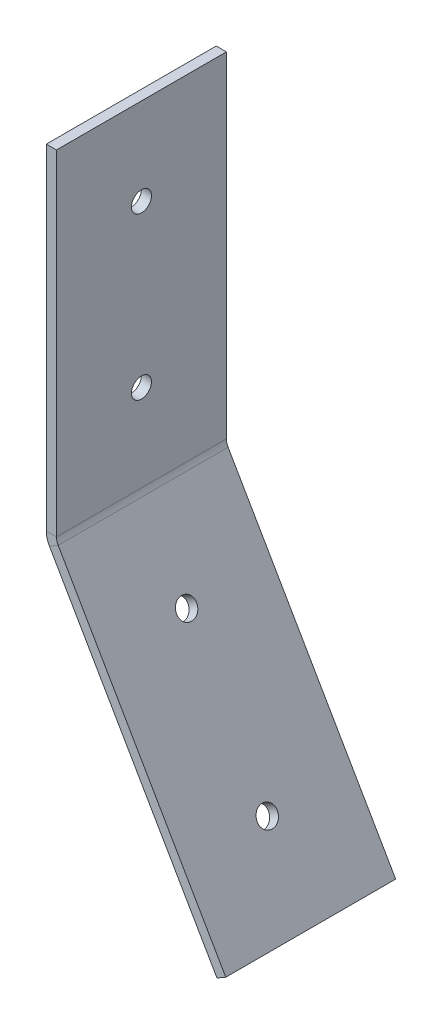
ISO-10303-21;
HEADER;
FILE_DESCRIPTION(('STEP AP214'),'2;1');
FILE_NAME('part.step','',(''),(''),'','','');
FILE_SCHEMA(('AUTOMOTIVE_DESIGN { 1 0 10303 214 1 1 1 1 }'));
ENDSEC;
DATA;
#1=APPLICATION_CONTEXT('core data for automotive mechanical design processes');
#2=APPLICATION_PROTOCOL_DEFINITION('international standard','automotive_design',2000,#1);
#3=PRODUCT_CONTEXT('',#1,'mechanical');
#4=PRODUCT('Part','Part','',(#3));
#5=PRODUCT_RELATED_PRODUCT_CATEGORY('part','',(#4));
#6=PRODUCT_DEFINITION_FORMATION('','',#4);
#7=PRODUCT_DEFINITION_CONTEXT('part definition',#1,'design');
#8=PRODUCT_DEFINITION('design','',#6,#7);
#9=PRODUCT_DEFINITION_SHAPE('','',#8);
#10=(LENGTH_UNIT() NAMED_UNIT(*) SI_UNIT(.MILLI.,.METRE.));
#11=(NAMED_UNIT(*) PLANE_ANGLE_UNIT() SI_UNIT($,.RADIAN.));
#12=(NAMED_UNIT(*) SI_UNIT($,.STERADIAN.) SOLID_ANGLE_UNIT());
#13=UNCERTAINTY_MEASURE_WITH_UNIT(LENGTH_MEASURE(1.E-05),#10,'distance_accuracy_value','');
#14=(GEOMETRIC_REPRESENTATION_CONTEXT(3) GLOBAL_UNCERTAINTY_ASSIGNED_CONTEXT((#13)) GLOBAL_UNIT_ASSIGNED_CONTEXT((#10,
#11,#12)) REPRESENTATION_CONTEXT('',''));
#15=CARTESIAN_POINT('',(0.,0.,0.));
#16=DIRECTION('',(0.,0.,1.));
#17=DIRECTION('',(1.,0.,0.));
#18=AXIS2_PLACEMENT_3D('',#15,#16,#17);
#19=CARTESIAN_POINT('',(-1.51892,0.,0.));
#20=DIRECTION('',(-1.,0.,0.));
#21=DIRECTION('',(0.,0.,1.));
#22=AXIS2_PLACEMENT_3D('',#19,#20,#21);
#23=PLANE('',#22);
#24=CARTESIAN_POINT('',(-1.51892,13.6975539968153,0.));
#25=DIRECTION('',(1.,0.,0.));
#26=DIRECTION('',(0.,0.,-1.));
#27=AXIS2_PLACEMENT_3D('',#24,#25,#26);
#28=CIRCLE('',#27,1.5);
#29=CARTESIAN_POINT('',(-1.51892,13.6975539968153,-1.5));
#30=VERTEX_POINT('',#29);
#31=EDGE_CURVE('E298',#30,#30,#28,.T.);
#32=ORIENTED_EDGE('',*,*,#31,.T.);
#33=EDGE_LOOP('',(#32));
#34=FACE_BOUND('',#33,.T.);
#35=DIRECTION('',(0.,0.,-1.));
#36=VECTOR('',#35,1.);
#37=CARTESIAN_POINT('',(-1.51892,0.69755399681533,0.));
#38=LINE('',#37,#36);
#39=CARTESIAN_POINT('',(-1.51892,0.69755399681533,12.7));
#40=VERTEX_POINT('',#39);
#41=CARTESIAN_POINT('',(-1.51892,0.697553996815328,-12.7));
#42=VERTEX_POINT('',#41);
#43=EDGE_CURVE('E227',#40,#42,#38,.T.);
#44=ORIENTED_EDGE('',*,*,#43,.F.);
#45=DIRECTION('',(0.,-1.,0.));
#46=VECTOR('',#45,1.);
#47=CARTESIAN_POINT('',(-1.51892,-50.8,12.7));
#48=LINE('',#47,#46);
#49=CARTESIAN_POINT('',(-1.51892,50.8,12.7));
#50=VERTEX_POINT('',#49);
#51=EDGE_CURVE('E210',#50,#40,#48,.T.);
#52=ORIENTED_EDGE('',*,*,#51,.F.);
#53=DIRECTION('',(0.,0.,1.));
#54=VECTOR('',#53,1.);
#55=CARTESIAN_POINT('',(-1.51892,50.8,-12.7));
#56=LINE('',#55,#54);
#57=CARTESIAN_POINT('',(-1.51892,50.8,-12.7));
#58=VERTEX_POINT('',#57);
#59=EDGE_CURVE('E213',#58,#50,#56,.T.);
#60=ORIENTED_EDGE('',*,*,#59,.F.);
#61=DIRECTION('',(0.,1.,0.));
#62=VECTOR('',#61,1.);
#63=CARTESIAN_POINT('',(-1.51892,-50.8,-12.7));
#64=LINE('',#63,#62);
#65=EDGE_CURVE('E176',#42,#58,#64,.T.);
#66=ORIENTED_EDGE('',*,*,#65,.F.);
#67=EDGE_LOOP('',(#44,#52,#60,#66));
#68=FACE_BOUND('',#67,.T.);
#69=CARTESIAN_POINT('',(-1.51892,37.8,0.));
#70=DIRECTION('',(1.,0.,0.));
#71=DIRECTION('',(0.,0.,-1.));
#72=AXIS2_PLACEMENT_3D('',#69,#70,#71);
#73=CIRCLE('',#72,1.5);
#74=CARTESIAN_POINT('',(-1.51892,37.8,-1.5));
#75=VERTEX_POINT('',#74);
#76=EDGE_CURVE('E290',#75,#75,#73,.T.);
#77=ORIENTED_EDGE('',*,*,#76,.T.);
#78=EDGE_LOOP('',(#77));
#79=FACE_BOUND('',#78,.T.);
#80=ADVANCED_FACE('F101',(#34,#68,#79),#23,.T.);
#81=CARTESIAN_POINT('',(-0.0935553926170124,0.349153478568761,0.));
#82=DIRECTION('',(-0.866025403784438,-0.500000000000001,0.));
#83=DIRECTION('',(0.,0.,1.));
#84=AXIS2_PLACEMENT_3D('',#81,#82,#83);
#85=PLANE('',#84);
#86=DIRECTION('',(0.,0.,-1.));
#87=VECTOR('',#86,1.);
#88=CARTESIAN_POINT('',(0.255221605790646,-0.254946003184671,0.));
#89=LINE('',#88,#87);
#90=CARTESIAN_POINT('',(0.255221605790644,-0.254946003184669,12.7));
#91=VERTEX_POINT('',#90);
#92=CARTESIAN_POINT('',(0.255221605790644,-0.254946003184669,-12.7));
#93=VERTEX_POINT('',#92);
#94=EDGE_CURVE('E113',#91,#93,#89,.T.);
#95=ORIENTED_EDGE('',*,*,#94,.F.);
#96=DIRECTION('',(0.500000000000001,-0.866025403784438,0.));
#97=VECTOR('',#96,1.);
#98=CARTESIAN_POINT('',(25.306444607383,-43.6449370336807,12.7));
#99=LINE('',#98,#97);
#100=CARTESIAN_POINT('',(25.306444607383,-43.6449370336807,12.7));
#101=VERTEX_POINT('',#100);
#102=EDGE_CURVE('E163',#91,#101,#99,.T.);
#103=ORIENTED_EDGE('',*,*,#102,.T.);
#104=DIRECTION('',(0.,0.,-1.));
#105=VECTOR('',#104,1.);
#106=CARTESIAN_POINT('',(25.306444607383,-43.6449370336807,-12.7));
#107=LINE('',#106,#105);
#108=CARTESIAN_POINT('',(25.306444607383,-43.6449370336807,-12.7));
#109=VERTEX_POINT('',#108);
#110=EDGE_CURVE('E143',#101,#109,#107,.T.);
#111=ORIENTED_EDGE('',*,*,#110,.T.);
#112=DIRECTION('',(-0.500000000000001,0.866025403784438,0.));
#113=VECTOR('',#112,1.);
#114=CARTESIAN_POINT('',(25.306444607383,-43.6449370336807,-12.7));
#115=LINE('',#114,#113);
#116=EDGE_CURVE('E156',#109,#93,#115,.T.);
#117=ORIENTED_EDGE('',*,*,#116,.T.);
#118=EDGE_LOOP('',(#95,#103,#111,#117));
#119=FACE_BOUND('',#118,.T.);
#120=CARTESIAN_POINT('',(6.75522160579066,-11.5132762523824,0.));
#121=DIRECTION('',(0.866025403784438,0.500000000000001,0.));
#122=DIRECTION('',(-0.500000000000001,0.866025403784438,0.));
#123=AXIS2_PLACEMENT_3D('',#120,#121,#122);
#124=CIRCLE('',#123,1.5);
#125=CARTESIAN_POINT('',(6.00522160579066,-10.2142381467057,0.));
#126=VERTEX_POINT('',#125);
#127=EDGE_CURVE('E275',#126,#126,#124,.T.);
#128=ORIENTED_EDGE('',*,*,#127,.F.);
#129=EDGE_LOOP('',(#128));
#130=FACE_BOUND('',#129,.T.);
#131=CARTESIAN_POINT('',(18.806444607383,-32.386606784483,0.));
#132=DIRECTION('',(0.866025403784438,0.500000000000001,0.));
#133=DIRECTION('',(-0.500000000000001,0.866025403784438,0.));
#134=AXIS2_PLACEMENT_3D('',#131,#132,#133);
#135=CIRCLE('',#134,1.5);
#136=CARTESIAN_POINT('',(18.056444607383,-31.0875686788063,0.));
#137=VERTEX_POINT('',#136);
#138=EDGE_CURVE('E283',#137,#137,#135,.T.);
#139=ORIENTED_EDGE('',*,*,#138,.F.);
#140=EDGE_LOOP('',(#139));
#141=FACE_BOUND('',#140,.T.);
#142=ADVANCED_FACE('F157',(#119,#130,#141),#85,.F.);
#143=CARTESIAN_POINT('',(23.9910213010668,-44.4043970336807,-12.7));
#144=DIRECTION('',(0.,0.,-1.));
#145=DIRECTION('',(-0.866025403784438,-0.500000000000001,0.));
#146=AXIS2_PLACEMENT_3D('',#143,#144,#145);
#147=PLANE('',#146);
#148=DIRECTION('',(-0.500000000000001,0.866025403784438,0.));
#149=VECTOR('',#148,1.);
#150=CARTESIAN_POINT('',(23.9910213010668,-44.4043970336807,-12.7));
#151=LINE('',#150,#149);
#152=CARTESIAN_POINT('',(23.9910213010668,-44.4043970336807,-12.7));
#153=VERTEX_POINT('',#152);
#154=CARTESIAN_POINT('',(-1.06020170052561,-1.01440600318467,-12.7));
#155=VERTEX_POINT('',#154);
#156=EDGE_CURVE('E167',#153,#155,#151,.T.);
#157=ORIENTED_EDGE('',*,*,#156,.T.);
#158=DIRECTION('',(0.866025403784438,0.500000000000001,0.));
#159=VECTOR('',#158,1.);
#160=CARTESIAN_POINT('',(-1.06020170052561,-1.01440600318467,-12.7));
#161=LINE('',#160,#159);
#162=EDGE_CURVE('E12',#155,#93,#161,.T.);
#163=ORIENTED_EDGE('',*,*,#162,.T.);
#164=ORIENTED_EDGE('',*,*,#116,.F.);
#165=DIRECTION('',(0.866025403784438,0.500000000000001,0.));
#166=VECTOR('',#165,1.);
#167=CARTESIAN_POINT('',(23.9910213010668,-44.4043970336807,-12.7));
#168=LINE('',#167,#166);
#169=EDGE_CURVE('E128',#153,#109,#168,.T.);
#170=ORIENTED_EDGE('',*,*,#169,.F.);
#171=EDGE_LOOP('',(#157,#163,#164,#170));
#172=FACE_BOUND('',#171,.T.);
#173=ADVANCED_FACE('F102',(#172),#147,.T.);
#174=CARTESIAN_POINT('',(23.9910213010668,-44.4043970336807,12.7));
#175=DIRECTION('',(0.,0.,1.));
#176=DIRECTION('',(0.866025403784438,0.500000000000001,0.));
#177=AXIS2_PLACEMENT_3D('',#174,#175,#176);
#178=PLANE('',#177);
#179=ORIENTED_EDGE('',*,*,#102,.F.);
#180=DIRECTION('',(-0.866025403784438,-0.500000000000001,0.));
#181=VECTOR('',#180,1.);
#182=CARTESIAN_POINT('',(-1.06020170052561,-1.01440600318467,12.7));
#183=LINE('',#182,#181);
#184=CARTESIAN_POINT('',(-1.06020170052562,-1.01440600318467,12.7));
#185=VERTEX_POINT('',#184);
#186=EDGE_CURVE('E240',#91,#185,#183,.T.);
#187=ORIENTED_EDGE('',*,*,#186,.T.);
#188=DIRECTION('',(0.500000000000001,-0.866025403784438,0.));
#189=VECTOR('',#188,1.);
#190=CARTESIAN_POINT('',(23.9910213010668,-44.4043970336807,12.7));
#191=LINE('',#190,#189);
#192=CARTESIAN_POINT('',(23.9910213010668,-44.4043970336807,12.7));
#193=VERTEX_POINT('',#192);
#194=EDGE_CURVE('E110',#185,#193,#191,.T.);
#195=ORIENTED_EDGE('',*,*,#194,.T.);
#196=DIRECTION('',(0.866025403784438,0.500000000000001,0.));
#197=VECTOR('',#196,1.);
#198=CARTESIAN_POINT('',(23.9910213010668,-44.4043970336807,12.7));
#199=LINE('',#198,#197);
#200=EDGE_CURVE('E151',#193,#101,#199,.T.);
#201=ORIENTED_EDGE('',*,*,#200,.T.);
#202=EDGE_LOOP('',(#179,#187,#195,#201));
#203=FACE_BOUND('',#202,.T.);
#204=ADVANCED_FACE('F341',(#203),#178,.T.);
#205=CARTESIAN_POINT('',(-1.40897869893327,-0.41030652143124,0.));
#206=DIRECTION('',(-0.866025403784438,-0.500000000000001,0.));
#207=DIRECTION('',(0.,0.,1.));
#208=AXIS2_PLACEMENT_3D('',#205,#206,#207);
#209=PLANE('',#208);
#210=CARTESIAN_POINT('',(17.4910213010668,-33.146066784483,0.));
#211=DIRECTION('',(-0.866025403784438,-0.500000000000001,0.));
#212=DIRECTION('',(0.500000000000001,-0.866025403784438,0.));
#213=AXIS2_PLACEMENT_3D('',#210,#211,#212);
#214=CIRCLE('',#213,1.5);
#215=CARTESIAN_POINT('',(18.2410213010668,-34.4451048901597,0.));
#216=VERTEX_POINT('',#215);
#217=EDGE_CURVE('E278',#216,#216,#214,.T.);
#218=ORIENTED_EDGE('',*,*,#217,.F.);
#219=EDGE_LOOP('',(#218));
#220=FACE_BOUND('',#219,.T.);
#221=CARTESIAN_POINT('',(5.4397982994744,-12.2727362523824,0.));
#222=DIRECTION('',(-0.866025403784438,-0.500000000000001,0.));
#223=DIRECTION('',(0.500000000000001,-0.866025403784438,0.));
#224=AXIS2_PLACEMENT_3D('',#221,#222,#223);
#225=CIRCLE('',#224,1.5);
#226=CARTESIAN_POINT('',(6.1897982994744,-13.571774358059,0.));
#227=VERTEX_POINT('',#226);
#228=EDGE_CURVE('E265',#227,#227,#225,.T.);
#229=ORIENTED_EDGE('',*,*,#228,.F.);
#230=EDGE_LOOP('',(#229));
#231=FACE_BOUND('',#230,.T.);
#232=ORIENTED_EDGE('',*,*,#194,.F.);
#233=DIRECTION('',(0.,0.,-1.));
#234=VECTOR('',#233,1.);
#235=CARTESIAN_POINT('',(-1.06020170052561,-1.01440600318467,0.));
#236=LINE('',#235,#234);
#237=EDGE_CURVE('E148',#185,#155,#236,.T.);
#238=ORIENTED_EDGE('',*,*,#237,.T.);
#239=ORIENTED_EDGE('',*,*,#156,.F.);
#240=DIRECTION('',(0.,0.,-1.));
#241=VECTOR('',#240,1.);
#242=CARTESIAN_POINT('',(23.9910213010668,-44.4043970336807,-12.7));
#243=LINE('',#242,#241);
#244=EDGE_CURVE('E150',#193,#153,#243,.T.);
#245=ORIENTED_EDGE('',*,*,#244,.F.);
#246=EDGE_LOOP('',(#232,#238,#239,#245));
#247=FACE_BOUND('',#246,.T.);
#248=ADVANCED_FACE('F333',(#220,#231,#247),#209,.T.);
#249=CARTESIAN_POINT('',(23.9910213010668,-44.4043970336807,-12.7));
#250=DIRECTION('',(0.500000000000001,-0.866025403784438,0.));
#251=DIRECTION('',(0.,0.,-1.));
#252=AXIS2_PLACEMENT_3D('',#249,#250,#251);
#253=PLANE('',#252);
#254=ORIENTED_EDGE('',*,*,#110,.F.);
#255=ORIENTED_EDGE('',*,*,#200,.F.);
#256=ORIENTED_EDGE('',*,*,#244,.T.);
#257=ORIENTED_EDGE('',*,*,#169,.T.);
#258=EDGE_LOOP('',(#254,#255,#256,#257));
#259=FACE_BOUND('',#258,.T.);
#260=ADVANCED_FACE('F141',(#259),#253,.T.);
#261=CARTESIAN_POINT('',(-1.51892,50.8,-12.7));
#262=DIRECTION('',(0.,1.,0.));
#263=DIRECTION('',(0.,0.,1.));
#264=AXIS2_PLACEMENT_3D('',#261,#262,#263);
#265=PLANE('',#264);
#266=DIRECTION('',(0.,0.,1.));
#267=VECTOR('',#266,1.);
#268=CARTESIAN_POINT('',(0.,50.8,-12.7));
#269=LINE('',#268,#267);
#270=CARTESIAN_POINT('',(0.,50.8,-12.7));
#271=VERTEX_POINT('',#270);
#272=CARTESIAN_POINT('',(0.,50.8,12.7));
#273=VERTEX_POINT('',#272);
#274=EDGE_CURVE('E187',#271,#273,#269,.T.);
#275=ORIENTED_EDGE('',*,*,#274,.F.);
#276=DIRECTION('',(1.,0.,0.));
#277=VECTOR('',#276,1.);
#278=CARTESIAN_POINT('',(-1.51892,50.8,-12.7));
#279=LINE('',#278,#277);
#280=EDGE_CURVE('E175',#58,#271,#279,.T.);
#281=ORIENTED_EDGE('',*,*,#280,.F.);
#282=ORIENTED_EDGE('',*,*,#59,.T.);
#283=DIRECTION('',(1.,0.,0.));
#284=VECTOR('',#283,1.);
#285=CARTESIAN_POINT('',(-1.51892,50.8,12.7));
#286=LINE('',#285,#284);
#287=EDGE_CURVE('E212',#50,#273,#286,.T.);
#288=ORIENTED_EDGE('',*,*,#287,.T.);
#289=EDGE_LOOP('',(#275,#281,#282,#288));
#290=FACE_BOUND('',#289,.T.);
#291=ADVANCED_FACE('F373',(#290),#265,.T.);
#292=CARTESIAN_POINT('',(-1.51892,-50.8,12.7));
#293=DIRECTION('',(0.,0.,1.));
#294=DIRECTION('',(1.,0.,0.));
#295=AXIS2_PLACEMENT_3D('',#292,#293,#294);
#296=PLANE('',#295);
#297=DIRECTION('',(-1.,0.,0.));
#298=VECTOR('',#297,1.);
#299=CARTESIAN_POINT('',(-1.51892,0.697553996815328,12.7));
#300=LINE('',#299,#298);
#301=CARTESIAN_POINT('',(0.,0.697553996815328,12.7));
#302=VERTEX_POINT('',#301);
#303=EDGE_CURVE('E218',#302,#40,#300,.T.);
#304=ORIENTED_EDGE('',*,*,#303,.F.);
#305=DIRECTION('',(0.,-1.,0.));
#306=VECTOR('',#305,1.);
#307=CARTESIAN_POINT('',(0.,-50.8,12.7));
#308=LINE('',#307,#306);
#309=EDGE_CURVE('E204',#273,#302,#308,.T.);
#310=ORIENTED_EDGE('',*,*,#309,.F.);
#311=ORIENTED_EDGE('',*,*,#287,.F.);
#312=ORIENTED_EDGE('',*,*,#51,.T.);
#313=EDGE_LOOP('',(#304,#310,#311,#312));
#314=FACE_BOUND('',#313,.T.);
#315=ADVANCED_FACE('F315',(#314),#296,.T.);
#316=CARTESIAN_POINT('',(0.,0.,0.));
#317=DIRECTION('',(-1.,0.,0.));
#318=DIRECTION('',(0.,0.,1.));
#319=AXIS2_PLACEMENT_3D('',#316,#317,#318);
#320=PLANE('',#319);
#321=CARTESIAN_POINT('',(0.,13.6975539968153,0.));
#322=DIRECTION('',(1.,0.,0.));
#323=DIRECTION('',(0.,0.,-1.));
#324=AXIS2_PLACEMENT_3D('',#321,#322,#323);
#325=CIRCLE('',#324,1.5);
#326=CARTESIAN_POINT('',(0.,13.6975539968153,-1.5));
#327=VERTEX_POINT('',#326);
#328=EDGE_CURVE('E297',#327,#327,#325,.T.);
#329=ORIENTED_EDGE('',*,*,#328,.F.);
#330=EDGE_LOOP('',(#329));
#331=FACE_BOUND('',#330,.T.);
#332=CARTESIAN_POINT('',(0.,37.8,0.));
#333=DIRECTION('',(1.,0.,0.));
#334=DIRECTION('',(0.,0.,-1.));
#335=AXIS2_PLACEMENT_3D('',#332,#333,#334);
#336=CIRCLE('',#335,1.5);
#337=CARTESIAN_POINT('',(0.,37.8,-1.5));
#338=VERTEX_POINT('',#337);
#339=EDGE_CURVE('E292',#338,#338,#336,.T.);
#340=ORIENTED_EDGE('',*,*,#339,.F.);
#341=EDGE_LOOP('',(#340));
#342=FACE_BOUND('',#341,.T.);
#343=ORIENTED_EDGE('',*,*,#309,.T.);
#344=DIRECTION('',(0.,0.,-1.));
#345=VECTOR('',#344,1.);
#346=CARTESIAN_POINT('',(0.,0.69755399681533,0.));
#347=LINE('',#346,#345);
#348=CARTESIAN_POINT('',(0.,0.697553996815328,-12.7));
#349=VERTEX_POINT('',#348);
#350=EDGE_CURVE('E198',#302,#349,#347,.T.);
#351=ORIENTED_EDGE('',*,*,#350,.T.);
#352=DIRECTION('',(0.,1.,0.));
#353=VECTOR('',#352,1.);
#354=CARTESIAN_POINT('',(0.,-50.8,-12.7));
#355=LINE('',#354,#353);
#356=EDGE_CURVE('E193',#349,#271,#355,.T.);
#357=ORIENTED_EDGE('',*,*,#356,.T.);
#358=ORIENTED_EDGE('',*,*,#274,.T.);
#359=EDGE_LOOP('',(#343,#351,#357,#358));
#360=FACE_BOUND('',#359,.T.);
#361=ADVANCED_FACE('F308',(#331,#342,#360),#320,.F.);
#362=CARTESIAN_POINT('',(-1.51892,-50.8,-12.7));
#363=DIRECTION('',(0.,0.,-1.));
#364=DIRECTION('',(-1.,0.,0.));
#365=AXIS2_PLACEMENT_3D('',#362,#363,#364);
#366=PLANE('',#365);
#367=DIRECTION('',(1.,0.,0.));
#368=VECTOR('',#367,1.);
#369=CARTESIAN_POINT('',(-1.51892,0.697553996815328,-12.7));
#370=LINE('',#369,#368);
#371=EDGE_CURVE('E225',#42,#349,#370,.T.);
#372=ORIENTED_EDGE('',*,*,#371,.F.);
#373=ORIENTED_EDGE('',*,*,#65,.T.);
#374=ORIENTED_EDGE('',*,*,#280,.T.);
#375=ORIENTED_EDGE('',*,*,#356,.F.);
#376=EDGE_LOOP('',(#372,#373,#374,#375));
#377=FACE_BOUND('',#376,.T.);
#378=ADVANCED_FACE('F311',(#377),#366,.T.);
#379=CARTESIAN_POINT('',(1.905,0.69755399681533,12.7));
#380=DIRECTION('',(0.,0.,1.));
#381=DIRECTION('',(1.,0.,0.));
#382=AXIS2_PLACEMENT_3D('',#379,#380,#381);
#383=PLANE('',#382);
#384=ORIENTED_EDGE('',*,*,#186,.F.);
#385=CARTESIAN_POINT('',(1.905,0.69755399681533,12.7));
#386=DIRECTION('',(0.,0.,1.));
#387=DIRECTION('',(1.,0.,0.));
#388=AXIS2_PLACEMENT_3D('',#385,#386,#387);
#389=CIRCLE('',#388,1.905);
#390=EDGE_CURVE('E254',#91,#302,#389,.F.);
#391=ORIENTED_EDGE('',*,*,#390,.T.);
#392=ORIENTED_EDGE('',*,*,#303,.T.);
#393=CARTESIAN_POINT('',(1.905,0.69755399681533,12.7));
#394=DIRECTION('',(0.,0.,-1.));
#395=DIRECTION('',(1.,0.,0.));
#396=AXIS2_PLACEMENT_3D('',#393,#394,#395);
#397=CIRCLE('',#396,3.42392);
#398=EDGE_CURVE('E256',#185,#40,#397,.T.);
#399=ORIENTED_EDGE('',*,*,#398,.F.);
#400=EDGE_LOOP('',(#384,#391,#392,#399));
#401=FACE_BOUND('',#400,.T.);
#402=ADVANCED_FACE('F326',(#401),#383,.T.);
#403=CARTESIAN_POINT('',(1.905,0.69755399681533,-12.7));
#404=DIRECTION('',(0.,0.,-1.));
#405=DIRECTION('',(-1.,0.,0.));
#406=AXIS2_PLACEMENT_3D('',#403,#404,#405);
#407=PLANE('',#406);
#408=CARTESIAN_POINT('',(1.905,0.69755399681533,-12.7));
#409=DIRECTION('',(0.,0.,1.));
#410=DIRECTION('',(1.,0.,0.));
#411=AXIS2_PLACEMENT_3D('',#408,#409,#410);
#412=CIRCLE('',#411,1.905);
#413=EDGE_CURVE('E186',#349,#93,#412,.T.);
#414=ORIENTED_EDGE('',*,*,#413,.T.);
#415=ORIENTED_EDGE('',*,*,#162,.F.);
#416=CARTESIAN_POINT('',(1.905,0.69755399681533,-12.7));
#417=DIRECTION('',(0.,0.,1.));
#418=DIRECTION('',(-1.,0.,0.));
#419=AXIS2_PLACEMENT_3D('',#416,#417,#418);
#420=CIRCLE('',#419,3.42392);
#421=EDGE_CURVE('E122',#42,#155,#420,.T.);
#422=ORIENTED_EDGE('',*,*,#421,.F.);
#423=ORIENTED_EDGE('',*,*,#371,.T.);
#424=EDGE_LOOP('',(#414,#415,#422,#423));
#425=FACE_BOUND('',#424,.T.);
#426=ADVANCED_FACE('F257',(#425),#407,.T.);
#427=CARTESIAN_POINT('',(1.905,0.69755399681533,-25.4835916675867));
#428=DIRECTION('',(0.,0.,1.));
#429=DIRECTION('',(1.,0.,0.));
#430=AXIS2_PLACEMENT_3D('',#427,#428,#429);
#431=CYLINDRICAL_SURFACE('',#430,3.42392);
#432=ORIENTED_EDGE('',*,*,#43,.T.);
#433=ORIENTED_EDGE('',*,*,#421,.T.);
#434=ORIENTED_EDGE('',*,*,#237,.F.);
#435=ORIENTED_EDGE('',*,*,#398,.T.);
#436=EDGE_LOOP('',(#432,#433,#434,#435));
#437=FACE_BOUND('',#436,.T.);
#438=ADVANCED_FACE('F331',(#437),#431,.T.);
#439=CARTESIAN_POINT('',(1.905,0.69755399681533,-25.4835916675867));
#440=DIRECTION('',(0.,0.,1.));
#441=DIRECTION('',(1.,0.,0.));
#442=AXIS2_PLACEMENT_3D('',#439,#440,#441);
#443=CYLINDRICAL_SURFACE('',#442,1.905);
#444=ORIENTED_EDGE('',*,*,#350,.F.);
#445=ORIENTED_EDGE('',*,*,#390,.F.);
#446=ORIENTED_EDGE('',*,*,#94,.T.);
#447=ORIENTED_EDGE('',*,*,#413,.F.);
#448=EDGE_LOOP('',(#444,#445,#446,#447));
#449=FACE_BOUND('',#448,.T.);
#450=ADVANCED_FACE('F248',(#449),#443,.F.);
#451=CARTESIAN_POINT('',(6.75522160579066,-11.5132762523824,0.));
#452=DIRECTION('',(0.866025403784438,0.500000000000001,0.));
#453=DIRECTION('',(-0.500000000000001,0.866025403784438,0.));
#454=AXIS2_PLACEMENT_3D('',#451,#452,#453);
#455=CYLINDRICAL_SURFACE('',#454,1.5);
#456=ORIENTED_EDGE('',*,*,#127,.T.);
#457=EDGE_LOOP('',(#456));
#458=FACE_BOUND('',#457,.T.);
#459=ORIENTED_EDGE('',*,*,#228,.T.);
#460=EDGE_LOOP('',(#459));
#461=FACE_BOUND('',#460,.T.);
#462=ADVANCED_FACE('F462',(#458,#461),#455,.F.);
#463=CARTESIAN_POINT('',(18.806444607383,-32.386606784483,0.));
#464=DIRECTION('',(0.866025403784438,0.500000000000001,0.));
#465=DIRECTION('',(-0.500000000000001,0.866025403784438,0.));
#466=AXIS2_PLACEMENT_3D('',#463,#464,#465);
#467=CYLINDRICAL_SURFACE('',#466,1.5);
#468=ORIENTED_EDGE('',*,*,#138,.T.);
#469=EDGE_LOOP('',(#468));
#470=FACE_BOUND('',#469,.T.);
#471=ORIENTED_EDGE('',*,*,#217,.T.);
#472=EDGE_LOOP('',(#471));
#473=FACE_BOUND('',#472,.T.);
#474=ADVANCED_FACE('F477',(#470,#473),#467,.F.);
#475=CARTESIAN_POINT('',(0.,37.8,0.));
#476=DIRECTION('',(1.,0.,0.));
#477=DIRECTION('',(0.,0.,-1.));
#478=AXIS2_PLACEMENT_3D('',#475,#476,#477);
#479=CYLINDRICAL_SURFACE('',#478,1.5);
#480=ORIENTED_EDGE('',*,*,#76,.F.);
#481=EDGE_LOOP('',(#480));
#482=FACE_BOUND('',#481,.T.);
#483=ORIENTED_EDGE('',*,*,#339,.T.);
#484=EDGE_LOOP('',(#483));
#485=FACE_BOUND('',#484,.T.);
#486=ADVANCED_FACE('F487',(#482,#485),#479,.F.);
#487=CARTESIAN_POINT('',(0.,13.6975539968153,0.));
#488=DIRECTION('',(1.,0.,0.));
#489=DIRECTION('',(0.,0.,-1.));
#490=AXIS2_PLACEMENT_3D('',#487,#488,#489);
#491=CYLINDRICAL_SURFACE('',#490,1.5);
#492=ORIENTED_EDGE('',*,*,#31,.F.);
#493=EDGE_LOOP('',(#492));
#494=FACE_BOUND('',#493,.T.);
#495=ORIENTED_EDGE('',*,*,#328,.T.);
#496=EDGE_LOOP('',(#495));
#497=FACE_BOUND('',#496,.T.);
#498=ADVANCED_FACE('F306',(#494,#497),#491,.F.);
#499=CLOSED_SHELL('',(#80,#142,#173,#204,#248,#260,#291,#315,#361,#378,#402,#426,#438,#450,#462,
#474,#486,#498));
#500=MANIFOLD_SOLID_BREP('B2',#499);
#501=ADVANCED_BREP_SHAPE_REPRESENTATION('',(#18,#500),#14);
#502=SHAPE_DEFINITION_REPRESENTATION(#9,#501);
ENDSEC;
END-ISO-10303-21;
